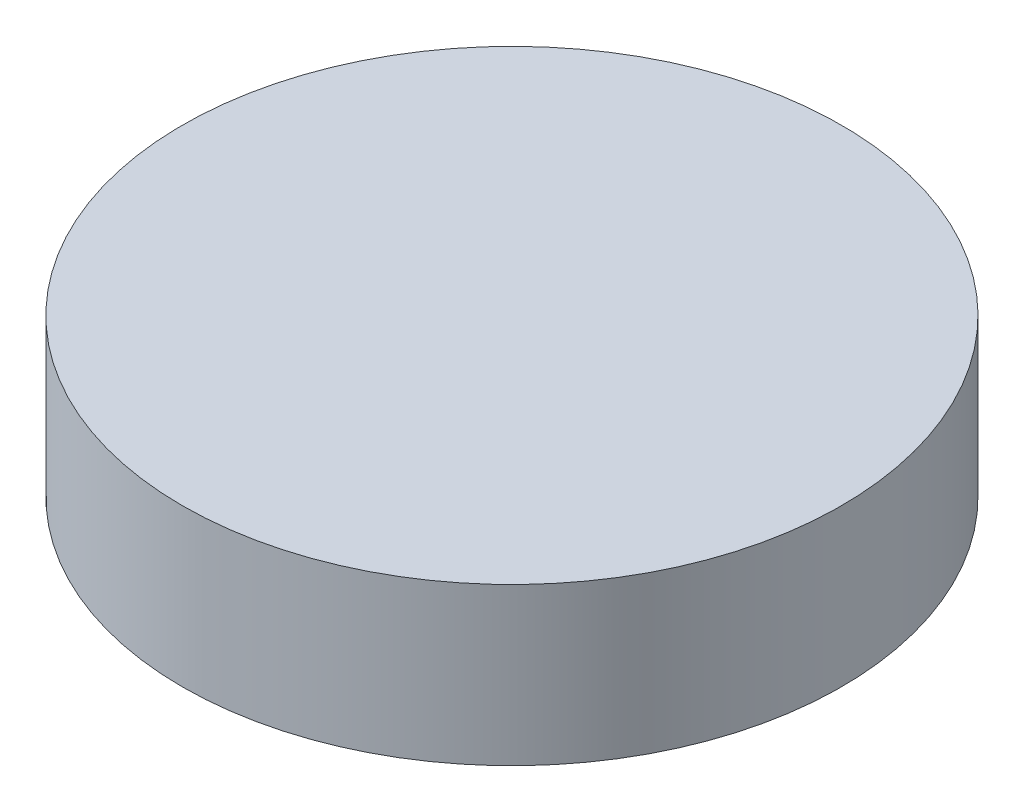
ISO-10303-21;
HEADER;
FILE_DESCRIPTION(('STEP AP214'),'2;1');
FILE_NAME('part.step','',(''),(''),'','','');
FILE_SCHEMA(('AUTOMOTIVE_DESIGN { 1 0 10303 214 1 1 1 1 }'));
ENDSEC;
DATA;
#1=APPLICATION_CONTEXT('core data for automotive mechanical design processes');
#2=APPLICATION_PROTOCOL_DEFINITION('international standard','automotive_design',2000,#1);
#3=PRODUCT_CONTEXT('',#1,'mechanical');
#4=PRODUCT('Part','Part','',(#3));
#5=PRODUCT_RELATED_PRODUCT_CATEGORY('part','',(#4));
#6=PRODUCT_DEFINITION_FORMATION('','',#4);
#7=PRODUCT_DEFINITION_CONTEXT('part definition',#1,'design');
#8=PRODUCT_DEFINITION('design','',#6,#7);
#9=PRODUCT_DEFINITION_SHAPE('','',#8);
#10=(LENGTH_UNIT() NAMED_UNIT(*) SI_UNIT(.MILLI.,.METRE.));
#11=(NAMED_UNIT(*) PLANE_ANGLE_UNIT() SI_UNIT($,.RADIAN.));
#12=(NAMED_UNIT(*) SI_UNIT($,.STERADIAN.) SOLID_ANGLE_UNIT());
#13=UNCERTAINTY_MEASURE_WITH_UNIT(LENGTH_MEASURE(1.E-05),#10,'distance_accuracy_value','');
#14=(GEOMETRIC_REPRESENTATION_CONTEXT(3) GLOBAL_UNCERTAINTY_ASSIGNED_CONTEXT((#13)) GLOBAL_UNIT_ASSIGNED_CONTEXT((#10,
#11,#12)) REPRESENTATION_CONTEXT('',''));
#15=CARTESIAN_POINT('',(0.,0.,0.));
#16=DIRECTION('',(0.,0.,1.));
#17=DIRECTION('',(1.,0.,0.));
#18=AXIS2_PLACEMENT_3D('',#15,#16,#17);
#19=CARTESIAN_POINT('',(0.,5.,0.));
#20=DIRECTION('',(0.,-1.,0.));
#21=DIRECTION('',(0.,0.,-1.));
#22=AXIS2_PLACEMENT_3D('',#19,#20,#21);
#23=CYLINDRICAL_SURFACE('',#22,10.5);
#24=CARTESIAN_POINT('',(0.,5.,0.));
#25=DIRECTION('',(0.,1.,0.));
#26=DIRECTION('',(0.,0.,1.));
#27=AXIS2_PLACEMENT_3D('',#24,#25,#26);
#28=CIRCLE('',#27,10.5);
#29=CARTESIAN_POINT('',(0.,5.,10.5));
#30=VERTEX_POINT('',#29);
#31=EDGE_CURVE('E10',#30,#30,#28,.T.);
#32=ORIENTED_EDGE('',*,*,#31,.F.);
#33=EDGE_LOOP('',(#32));
#34=FACE_BOUND('',#33,.T.);
#35=CARTESIAN_POINT('',(0.,0.,0.));
#36=DIRECTION('',(0.,1.,0.));
#37=DIRECTION('',(0.,0.,1.));
#38=AXIS2_PLACEMENT_3D('',#35,#36,#37);
#39=CIRCLE('',#38,10.5);
#40=CARTESIAN_POINT('',(0.,0.,10.5));
#41=VERTEX_POINT('',#40);
#42=EDGE_CURVE('E33',#41,#41,#39,.T.);
#43=ORIENTED_EDGE('',*,*,#42,.T.);
#44=EDGE_LOOP('',(#43));
#45=FACE_BOUND('',#44,.T.);
#46=ADVANCED_FACE('F30',(#34,#45),#23,.T.);
#47=CARTESIAN_POINT('',(0.,5.,0.));
#48=DIRECTION('',(0.,1.,0.));
#49=DIRECTION('',(0.,0.,1.));
#50=AXIS2_PLACEMENT_3D('',#47,#48,#49);
#51=PLANE('',#50);
#52=ORIENTED_EDGE('',*,*,#31,.T.);
#53=EDGE_LOOP('',(#52));
#54=FACE_BOUND('',#53,.T.);
#55=ADVANCED_FACE('F45',(#54),#51,.T.);
#56=CARTESIAN_POINT('',(0.,0.,0.));
#57=DIRECTION('',(0.,1.,0.));
#58=DIRECTION('',(0.,0.,1.));
#59=AXIS2_PLACEMENT_3D('',#56,#57,#58);
#60=PLANE('',#59);
#61=ORIENTED_EDGE('',*,*,#42,.F.);
#62=EDGE_LOOP('',(#61));
#63=FACE_BOUND('',#62,.T.);
#64=ADVANCED_FACE('F43',(#63),#60,.F.);
#65=CLOSED_SHELL('',(#46,#55,#64));
#66=MANIFOLD_SOLID_BREP('B2',#65);
#67=ADVANCED_BREP_SHAPE_REPRESENTATION('',(#18,#66),#14);
#68=SHAPE_DEFINITION_REPRESENTATION(#9,#67);
ENDSEC;
END-ISO-10303-21;
